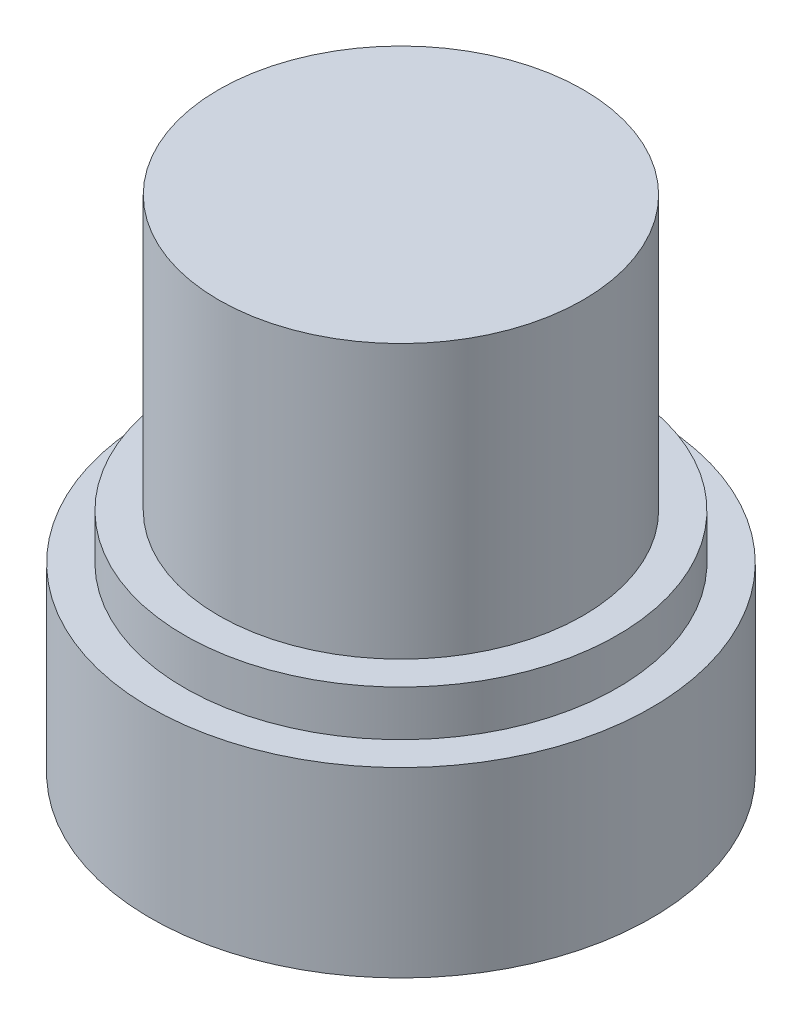
ISO-10303-21;
HEADER;
FILE_DESCRIPTION(('STEP AP214'),'2;1');
FILE_NAME('part.step','',(''),(''),'','','');
FILE_SCHEMA(('AUTOMOTIVE_DESIGN { 1 0 10303 214 1 1 1 1 }'));
ENDSEC;
DATA;
#1=APPLICATION_CONTEXT('core data for automotive mechanical design processes');
#2=APPLICATION_PROTOCOL_DEFINITION('international standard','automotive_design',2000,#1);
#3=PRODUCT_CONTEXT('',#1,'mechanical');
#4=PRODUCT('Part','Part','',(#3));
#5=PRODUCT_RELATED_PRODUCT_CATEGORY('part','',(#4));
#6=PRODUCT_DEFINITION_FORMATION('','',#4);
#7=PRODUCT_DEFINITION_CONTEXT('part definition',#1,'design');
#8=PRODUCT_DEFINITION('design','',#6,#7);
#9=PRODUCT_DEFINITION_SHAPE('','',#8);
#10=(LENGTH_UNIT() NAMED_UNIT(*) SI_UNIT(.MILLI.,.METRE.));
#11=(NAMED_UNIT(*) PLANE_ANGLE_UNIT() SI_UNIT($,.RADIAN.));
#12=(NAMED_UNIT(*) SI_UNIT($,.STERADIAN.) SOLID_ANGLE_UNIT());
#13=UNCERTAINTY_MEASURE_WITH_UNIT(LENGTH_MEASURE(1.E-05),#10,'distance_accuracy_value','');
#14=(GEOMETRIC_REPRESENTATION_CONTEXT(3) GLOBAL_UNCERTAINTY_ASSIGNED_CONTEXT((#13)) GLOBAL_UNIT_ASSIGNED_CONTEXT((#10,
#11,#12)) REPRESENTATION_CONTEXT('',''));
#15=CARTESIAN_POINT('',(0.,0.,0.));
#16=DIRECTION('',(0.,0.,1.));
#17=DIRECTION('',(1.,0.,0.));
#18=AXIS2_PLACEMENT_3D('',#15,#16,#17);
#19=CARTESIAN_POINT('',(0.,0.,0.));
#20=DIRECTION('',(0.,1.,0.));
#21=DIRECTION('',(-1.,0.,0.));
#22=AXIS2_PLACEMENT_3D('',#19,#20,#21);
#23=PLANE('',#22);
#24=CARTESIAN_POINT('',(0.,0.,0.));
#25=DIRECTION('',(0.,1.,0.));
#26=DIRECTION('',(-1.,0.,0.));
#27=AXIS2_PLACEMENT_3D('',#24,#25,#26);
#28=CIRCLE('',#27,2.75);
#29=CARTESIAN_POINT('',(-2.75,0.,0.));
#30=VERTEX_POINT('',#29);
#31=EDGE_CURVE('E10',#30,#30,#28,.T.);
#32=ORIENTED_EDGE('',*,*,#31,.F.);
#33=EDGE_LOOP('',(#32));
#34=FACE_BOUND('',#33,.T.);
#35=ADVANCED_FACE('F31',(#34),#23,.F.);
#36=CARTESIAN_POINT('',(0.,5.5,0.));
#37=DIRECTION('',(0.,1.,0.));
#38=DIRECTION('',(-1.,0.,0.));
#39=AXIS2_PLACEMENT_3D('',#36,#37,#38);
#40=CYLINDRICAL_SURFACE('',#39,2.75);
#41=CARTESIAN_POINT('',(0.,2.,0.));
#42=DIRECTION('',(0.,1.,0.));
#43=DIRECTION('',(-1.,0.,0.));
#44=AXIS2_PLACEMENT_3D('',#41,#42,#43);
#45=CIRCLE('',#44,2.75);
#46=CARTESIAN_POINT('',(-2.75,2.,0.));
#47=VERTEX_POINT('',#46);
#48=EDGE_CURVE('E37',#47,#47,#45,.T.);
#49=ORIENTED_EDGE('',*,*,#48,.F.);
#50=EDGE_LOOP('',(#49));
#51=FACE_BOUND('',#50,.T.);
#52=ORIENTED_EDGE('',*,*,#31,.T.);
#53=EDGE_LOOP('',(#52));
#54=FACE_BOUND('',#53,.T.);
#55=ADVANCED_FACE('F79',(#51,#54),#40,.T.);
#56=CARTESIAN_POINT('',(2.75,2.,0.));
#57=DIRECTION('',(0.,-1.,0.));
#58=DIRECTION('',(1.,0.,0.));
#59=AXIS2_PLACEMENT_3D('',#56,#57,#58);
#60=PLANE('',#59);
#61=CARTESIAN_POINT('',(0.,2.,0.));
#62=DIRECTION('',(0.,1.,0.));
#63=DIRECTION('',(-1.,0.,0.));
#64=AXIS2_PLACEMENT_3D('',#61,#62,#63);
#65=CIRCLE('',#64,2.375);
#66=CARTESIAN_POINT('',(-2.375,2.,0.));
#67=VERTEX_POINT('',#66);
#68=EDGE_CURVE('E41',#67,#67,#65,.T.);
#69=ORIENTED_EDGE('',*,*,#68,.F.);
#70=EDGE_LOOP('',(#69));
#71=FACE_BOUND('',#70,.T.);
#72=ORIENTED_EDGE('',*,*,#48,.T.);
#73=EDGE_LOOP('',(#72));
#74=FACE_BOUND('',#73,.T.);
#75=ADVANCED_FACE('F74',(#71,#74),#60,.F.);
#76=CARTESIAN_POINT('',(0.,5.5,0.));
#77=DIRECTION('',(0.,1.,0.));
#78=DIRECTION('',(-1.,0.,0.));
#79=AXIS2_PLACEMENT_3D('',#76,#77,#78);
#80=CYLINDRICAL_SURFACE('',#79,2.375);
#81=CARTESIAN_POINT('',(0.,2.5,0.));
#82=DIRECTION('',(0.,1.,0.));
#83=DIRECTION('',(-1.,0.,0.));
#84=AXIS2_PLACEMENT_3D('',#81,#82,#83);
#85=CIRCLE('',#84,2.375);
#86=CARTESIAN_POINT('',(-2.375,2.5,0.));
#87=VERTEX_POINT('',#86);
#88=EDGE_CURVE('E45',#87,#87,#85,.T.);
#89=ORIENTED_EDGE('',*,*,#88,.F.);
#90=EDGE_LOOP('',(#89));
#91=FACE_BOUND('',#90,.T.);
#92=ORIENTED_EDGE('',*,*,#68,.T.);
#93=EDGE_LOOP('',(#92));
#94=FACE_BOUND('',#93,.T.);
#95=ADVANCED_FACE('F68',(#91,#94),#80,.T.);
#96=CARTESIAN_POINT('',(2.375,2.5,0.));
#97=DIRECTION('',(0.,-1.,0.));
#98=DIRECTION('',(1.,0.,0.));
#99=AXIS2_PLACEMENT_3D('',#96,#97,#98);
#100=PLANE('',#99);
#101=CARTESIAN_POINT('',(0.,2.5,0.));
#102=DIRECTION('',(0.,1.,0.));
#103=DIRECTION('',(-1.,0.,0.));
#104=AXIS2_PLACEMENT_3D('',#101,#102,#103);
#105=CIRCLE('',#104,2.);
#106=CARTESIAN_POINT('',(-2.,2.5,0.));
#107=VERTEX_POINT('',#106);
#108=EDGE_CURVE('E50',#107,#107,#105,.T.);
#109=ORIENTED_EDGE('',*,*,#108,.F.);
#110=EDGE_LOOP('',(#109));
#111=FACE_BOUND('',#110,.T.);
#112=ORIENTED_EDGE('',*,*,#88,.T.);
#113=EDGE_LOOP('',(#112));
#114=FACE_BOUND('',#113,.T.);
#115=ADVANCED_FACE('F62',(#111,#114),#100,.F.);
#116=CARTESIAN_POINT('',(0.,5.5,0.));
#117=DIRECTION('',(0.,1.,0.));
#118=DIRECTION('',(-1.,0.,0.));
#119=AXIS2_PLACEMENT_3D('',#116,#117,#118);
#120=CYLINDRICAL_SURFACE('',#119,2.);
#121=CARTESIAN_POINT('',(0.,5.5,0.));
#122=DIRECTION('',(0.,1.,0.));
#123=DIRECTION('',(-1.,0.,0.));
#124=AXIS2_PLACEMENT_3D('',#121,#122,#123);
#125=CIRCLE('',#124,2.);
#126=CARTESIAN_POINT('',(-2.,5.5,0.));
#127=VERTEX_POINT('',#126);
#128=EDGE_CURVE('E53',#127,#127,#125,.T.);
#129=ORIENTED_EDGE('',*,*,#128,.F.);
#130=EDGE_LOOP('',(#129));
#131=FACE_BOUND('',#130,.T.);
#132=ORIENTED_EDGE('',*,*,#108,.T.);
#133=EDGE_LOOP('',(#132));
#134=FACE_BOUND('',#133,.T.);
#135=ADVANCED_FACE('F59',(#131,#134),#120,.T.);
#136=CARTESIAN_POINT('',(2.,5.5,0.));
#137=DIRECTION('',(0.,-1.,0.));
#138=DIRECTION('',(1.,0.,0.));
#139=AXIS2_PLACEMENT_3D('',#136,#137,#138);
#140=PLANE('',#139);
#141=ORIENTED_EDGE('',*,*,#128,.T.);
#142=EDGE_LOOP('',(#141));
#143=FACE_BOUND('',#142,.T.);
#144=ADVANCED_FACE('F57',(#143),#140,.F.);
#145=CLOSED_SHELL('',(#35,#55,#75,#95,#115,#135,#144));
#146=MANIFOLD_SOLID_BREP('B2',#145);
#147=ADVANCED_BREP_SHAPE_REPRESENTATION('',(#18,#146),#14);
#148=SHAPE_DEFINITION_REPRESENTATION(#9,#147);
ENDSEC;
END-ISO-10303-21;
